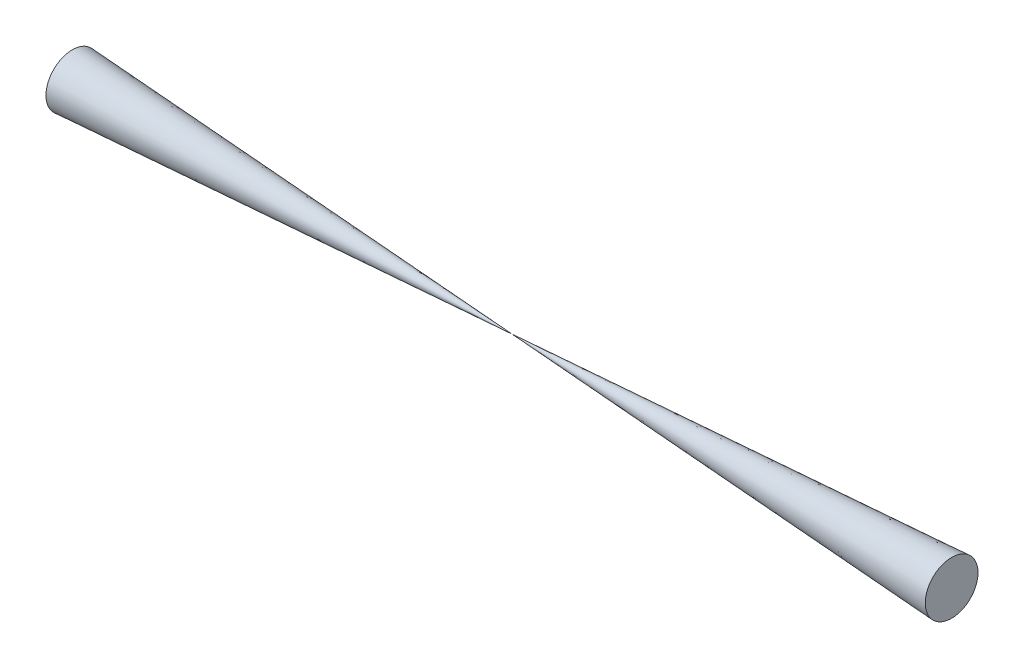
ISO-10303-21;
HEADER;
FILE_DESCRIPTION(('STEP AP214'),'2;1');
FILE_NAME('part.step','',(''),(''),'','','');
FILE_SCHEMA(('AUTOMOTIVE_DESIGN { 1 0 10303 214 1 1 1 1 }'));
ENDSEC;
DATA;
#1=APPLICATION_CONTEXT('core data for automotive mechanical design processes');
#2=APPLICATION_PROTOCOL_DEFINITION('international standard','automotive_design',2000,#1);
#3=PRODUCT_CONTEXT('',#1,'mechanical');
#4=PRODUCT('Part','Part','',(#3));
#5=PRODUCT_RELATED_PRODUCT_CATEGORY('part','',(#4));
#6=PRODUCT_DEFINITION_FORMATION('','',#4);
#7=PRODUCT_DEFINITION_CONTEXT('part definition',#1,'design');
#8=PRODUCT_DEFINITION('design','',#6,#7);
#9=PRODUCT_DEFINITION_SHAPE('','',#8);
#10=(LENGTH_UNIT() NAMED_UNIT(*) SI_UNIT(.MILLI.,.METRE.));
#11=(NAMED_UNIT(*) PLANE_ANGLE_UNIT() SI_UNIT($,.RADIAN.));
#12=(NAMED_UNIT(*) SI_UNIT($,.STERADIAN.) SOLID_ANGLE_UNIT());
#13=UNCERTAINTY_MEASURE_WITH_UNIT(LENGTH_MEASURE(1.E-05),#10,'distance_accuracy_value','');
#14=(GEOMETRIC_REPRESENTATION_CONTEXT(3) GLOBAL_UNCERTAINTY_ASSIGNED_CONTEXT((#13)) GLOBAL_UNIT_ASSIGNED_CONTEXT((#10,
#11,#12)) REPRESENTATION_CONTEXT('',''));
#15=CARTESIAN_POINT('',(0.,0.,0.));
#16=DIRECTION('',(0.,0.,1.));
#17=DIRECTION('',(1.,0.,0.));
#18=AXIS2_PLACEMENT_3D('',#15,#16,#17);
#19=CARTESIAN_POINT('',(200.,0.,0.));
#20=DIRECTION('',(1.,0.,0.));
#21=DIRECTION('',(0.,0.,-1.));
#22=AXIS2_PLACEMENT_3D('',#19,#20,#21);
#23=CONICAL_SURFACE('',#22,12.,0.0598783343266472);
#24=CARTESIAN_POINT('',(0.,0.,0.));
#25=DIRECTION('',(1.,0.,0.));
#26=DIRECTION('',(0.,0.,-1.));
#27=AXIS2_PLACEMENT_3D('',#24,#25,#26);
#28=CIRCLE('',#27,0.01);
#29=CARTESIAN_POINT('',(0.,0.,-0.00999999999999959));
#30=VERTEX_POINT('',#29);
#31=EDGE_CURVE('E42',#30,#30,#28,.T.);
#32=CARTESIAN_POINT('',(200.,0.,0.));
#33=DIRECTION('',(1.,0.,0.));
#34=DIRECTION('',(0.,0.,-1.));
#35=AXIS2_PLACEMENT_3D('',#32,#33,#34);
#36=CIRCLE('',#35,12.);
#37=CARTESIAN_POINT('',(200.,0.,-12.));
#38=VERTEX_POINT('',#37);
#39=EDGE_CURVE('E10',#38,#38,#36,.T.);
#40=CARTESIAN_POINT('',(0.,0.,-0.00999999999999959));
#41=CARTESIAN_POINT('',(2.08333333333334,0.,-0.134895833333333));
#42=CARTESIAN_POINT('',(4.16666666666667,0.,-0.259791666666667));
#43=CARTESIAN_POINT('',(8.33333333333334,0.,-0.509583333333334));
#44=CARTESIAN_POINT('',(10.4166666666667,0.,-0.634479166666668));
#45=CARTESIAN_POINT('',(14.5833333333333,0.,-0.884270833333334));
#46=CARTESIAN_POINT('',(16.6666666666667,0.,-1.00916666666667));
#47=CARTESIAN_POINT('',(20.8333333333333,0.,-1.25895833333333));
#48=CARTESIAN_POINT('',(22.9166666666667,0.,-1.38385416666667));
#49=CARTESIAN_POINT('',(27.0833333333333,0.,-1.63364583333333));
#50=CARTESIAN_POINT('',(29.1666666666667,0.,-1.75854166666667));
#51=CARTESIAN_POINT('',(33.3333333333333,0.,-2.00833333333333));
#52=CARTESIAN_POINT('',(35.4166666666667,0.,-2.13322916666667));
#53=CARTESIAN_POINT('',(39.5833333333333,0.,-2.38302083333333));
#54=CARTESIAN_POINT('',(41.6666666666667,0.,-2.50791666666667));
#55=CARTESIAN_POINT('',(45.8333333333333,0.,-2.75770833333333));
#56=CARTESIAN_POINT('',(47.9166666666667,0.,-2.88260416666667));
#57=CARTESIAN_POINT('',(52.0833333333333,0.,-3.13239583333333));
#58=CARTESIAN_POINT('',(54.1666666666667,0.,-3.25729166666667));
#59=CARTESIAN_POINT('',(58.3333333333333,0.,-3.50708333333333));
#60=CARTESIAN_POINT('',(60.4166666666667,0.,-3.63197916666667));
#61=CARTESIAN_POINT('',(64.5833333333333,0.,-3.88177083333333));
#62=CARTESIAN_POINT('',(66.6666666666667,0.,-4.00666666666667));
#63=CARTESIAN_POINT('',(70.8333333333333,0.,-4.25645833333333));
#64=CARTESIAN_POINT('',(72.9166666666667,0.,-4.38135416666667));
#65=CARTESIAN_POINT('',(77.0833333333333,0.,-4.63114583333333));
#66=CARTESIAN_POINT('',(79.1666666666667,0.,-4.75604166666667));
#67=CARTESIAN_POINT('',(83.3333333333333,0.,-5.00583333333333));
#68=CARTESIAN_POINT('',(85.4166666666667,0.,-5.13072916666667));
#69=CARTESIAN_POINT('',(89.5833333333333,0.,-5.38052083333333));
#70=CARTESIAN_POINT('',(91.6666666666667,0.,-5.50541666666667));
#71=CARTESIAN_POINT('',(95.8333333333333,0.,-5.75520833333333));
#72=CARTESIAN_POINT('',(97.9166666666667,0.,-5.88010416666667));
#73=CARTESIAN_POINT('',(102.083333333333,0.,-6.12989583333333));
#74=CARTESIAN_POINT('',(104.166666666667,0.,-6.25479166666667));
#75=CARTESIAN_POINT('',(108.333333333333,0.,-6.50458333333333));
#76=CARTESIAN_POINT('',(110.416666666667,0.,-6.62947916666667));
#77=CARTESIAN_POINT('',(114.583333333333,0.,-6.87927083333333));
#78=CARTESIAN_POINT('',(116.666666666667,0.,-7.00416666666667));
#79=CARTESIAN_POINT('',(120.833333333333,0.,-7.25395833333333));
#80=CARTESIAN_POINT('',(122.916666666667,0.,-7.37885416666667));
#81=CARTESIAN_POINT('',(127.083333333333,0.,-7.62864583333333));
#82=CARTESIAN_POINT('',(129.166666666667,0.,-7.75354166666667));
#83=CARTESIAN_POINT('',(133.333333333333,0.,-8.00333333333333));
#84=CARTESIAN_POINT('',(135.416666666667,0.,-8.12822916666667));
#85=CARTESIAN_POINT('',(139.583333333333,0.,-8.37802083333333));
#86=CARTESIAN_POINT('',(141.666666666667,0.,-8.50291666666667));
#87=CARTESIAN_POINT('',(145.833333333333,0.,-8.75270833333333));
#88=CARTESIAN_POINT('',(147.916666666667,0.,-8.87760416666667));
#89=CARTESIAN_POINT('',(152.083333333333,0.,-9.12739583333333));
#90=CARTESIAN_POINT('',(154.166666666667,0.,-9.25229166666667));
#91=CARTESIAN_POINT('',(158.333333333333,0.,-9.50208333333333));
#92=CARTESIAN_POINT('',(160.416666666667,0.,-9.62697916666666));
#93=CARTESIAN_POINT('',(164.583333333333,0.,-9.87677083333333));
#94=CARTESIAN_POINT('',(166.666666666667,0.,-10.0016666666667));
#95=CARTESIAN_POINT('',(170.833333333333,0.,-10.2514583333333));
#96=CARTESIAN_POINT('',(172.916666666667,0.,-10.3763541666667));
#97=CARTESIAN_POINT('',(177.083333333333,0.,-10.6261458333333));
#98=CARTESIAN_POINT('',(179.166666666667,0.,-10.7510416666667));
#99=CARTESIAN_POINT('',(183.333333333333,0.,-11.0008333333333));
#100=CARTESIAN_POINT('',(185.416666666667,0.,-11.1257291666667));
#101=CARTESIAN_POINT('',(189.583333333333,0.,-11.3755208333333));
#102=CARTESIAN_POINT('',(191.666666666667,0.,-11.5004166666667));
#103=CARTESIAN_POINT('',(195.833333333333,0.,-11.7502083333333));
#104=CARTESIAN_POINT('',(197.916666666667,0.,-11.8751041666667));
#105=CARTESIAN_POINT('',(200.,0.,-12.));
#106=B_SPLINE_CURVE_WITH_KNOTS('',3,(#40,#41,#42,#43,#44,#45,#46,#47,#48,#49,#50,#51,#52,#53,
#54,#55,#56,#57,#58,#59,#60,#61,#62,#63,#64,#65,#66,#67,#68,#69,#70,#71,#72,#73,#74,#75,#76,#77,
#78,#79,#80,#81,#82,#83,#84,#85,#86,#87,#88,#89,#90,#91,#92,#93,#94,#95,#96,#97,#98,#99,#100,
#101,#102,#103,#104,#105),.UNSPECIFIED.,.F.,.F.,(4,2,2,2,2,2,2,2,2,2,2,2,2,2,2,2,2,2,2,2,2,2,2,
2,2,2,2,2,2,2,2,2,4),(0.,6.26122118461377,12.5224423692275,18.7836635538413,25.0448847384551,
31.3061059230688,37.5673271076826,43.8285482922964,50.0897694769101,56.3509906615239,
62.6122118461377,68.8734330307515,75.1346542153652,81.395875399979,87.6570965845928,
93.9183177692066,100.17953895382,106.440760138434,112.701981323048,118.963202507662,
125.224423692275,131.485644876889,137.746866061503,144.008087246117,150.269308430731,
156.530529615344,162.791750799958,169.052971984572,175.314193169186,181.575414353799,
187.836635538413,194.097856723027,200.359077907641),.UNSPECIFIED.);
#107=EDGE_CURVE('BSEAM36',#30,#38,#106,.T.);
#108=ORIENTED_EDGE('',*,*,#31,.T.);
#109=ORIENTED_EDGE('',*,*,#39,.F.);
#110=ORIENTED_EDGE('',*,*,#107,.T.);
#111=ORIENTED_EDGE('',*,*,#107,.F.);
#112=EDGE_LOOP('',(#108,#110,#109,#111));
#113=FACE_BOUND('',#112,.T.);
#114=ADVANCED_FACE('F36',(#113),#23,.T.);
#115=CARTESIAN_POINT('',(200.,0.,-12.));
#116=DIRECTION('',(1.,0.,0.));
#117=DIRECTION('',(0.,0.,-1.));
#118=AXIS2_PLACEMENT_3D('',#115,#116,#117);
#119=PLANE('',#118);
#120=ORIENTED_EDGE('',*,*,#39,.T.);
#121=EDGE_LOOP('',(#120));
#122=FACE_BOUND('',#121,.T.);
#123=ADVANCED_FACE('F61',(#122),#119,.T.);
#124=CARTESIAN_POINT('',(-200.,0.,0.));
#125=DIRECTION('',(-1.,0.,0.));
#126=DIRECTION('',(0.,0.,-1.));
#127=AXIS2_PLACEMENT_3D('',#124,#125,#126);
#128=CONICAL_SURFACE('',#127,12.,0.0598783343266472);
#129=CARTESIAN_POINT('',(-200.,0.,0.));
#130=DIRECTION('',(1.,0.,0.));
#131=DIRECTION('',(0.,0.,-1.));
#132=AXIS2_PLACEMENT_3D('',#129,#130,#131);
#133=CIRCLE('',#132,12.);
#134=CARTESIAN_POINT('',(-200.,0.,-12.));
#135=VERTEX_POINT('',#134);
#136=EDGE_CURVE('E46',#135,#135,#133,.T.);
#137=CARTESIAN_POINT('',(0.,0.,-0.00999999999999959));
#138=CARTESIAN_POINT('',(-2.08333333333334,0.,-0.134895833333332));
#139=CARTESIAN_POINT('',(-4.16666666666667,0.,-0.259791666666665));
#140=CARTESIAN_POINT('',(-8.33333333333334,0.,-0.509583333333332));
#141=CARTESIAN_POINT('',(-10.4166666666667,0.,-0.634479166666665));
#142=CARTESIAN_POINT('',(-14.5833333333333,0.,-0.88427083333333));
#143=CARTESIAN_POINT('',(-16.6666666666667,0.,-1.00916666666666));
#144=CARTESIAN_POINT('',(-20.8333333333333,0.,-1.25895833333333));
#145=CARTESIAN_POINT('',(-22.9166666666667,0.,-1.38385416666666));
#146=CARTESIAN_POINT('',(-27.0833333333333,0.,-1.63364583333333));
#147=CARTESIAN_POINT('',(-29.1666666666667,0.,-1.75854166666666));
#148=CARTESIAN_POINT('',(-33.3333333333333,0.,-2.00833333333333));
#149=CARTESIAN_POINT('',(-35.4166666666667,0.,-2.13322916666666));
#150=CARTESIAN_POINT('',(-39.5833333333333,0.,-2.38302083333332));
#151=CARTESIAN_POINT('',(-41.6666666666667,0.,-2.50791666666666));
#152=CARTESIAN_POINT('',(-45.8333333333333,0.,-2.75770833333332));
#153=CARTESIAN_POINT('',(-47.9166666666667,0.,-2.88260416666666));
#154=CARTESIAN_POINT('',(-52.0833333333333,0.,-3.13239583333332));
#155=CARTESIAN_POINT('',(-54.1666666666667,0.,-3.25729166666665));
#156=CARTESIAN_POINT('',(-58.3333333333333,0.,-3.50708333333332));
#157=CARTESIAN_POINT('',(-60.4166666666667,0.,-3.63197916666665));
#158=CARTESIAN_POINT('',(-64.5833333333333,0.,-3.88177083333332));
#159=CARTESIAN_POINT('',(-66.6666666666667,0.,-4.00666666666665));
#160=CARTESIAN_POINT('',(-70.8333333333334,0.,-4.25645833333332));
#161=CARTESIAN_POINT('',(-72.9166666666667,0.,-4.38135416666665));
#162=CARTESIAN_POINT('',(-77.0833333333334,0.,-4.63114583333332));
#163=CARTESIAN_POINT('',(-79.1666666666667,0.,-4.75604166666665));
#164=CARTESIAN_POINT('',(-83.3333333333334,0.,-5.00583333333331));
#165=CARTESIAN_POINT('',(-85.4166666666667,0.,-5.13072916666665));
#166=CARTESIAN_POINT('',(-89.5833333333333,0.,-5.38052083333331));
#167=CARTESIAN_POINT('',(-91.6666666666667,0.,-5.50541666666664));
#168=CARTESIAN_POINT('',(-95.8333333333334,0.,-5.75520833333331));
#169=CARTESIAN_POINT('',(-97.9166666666667,0.,-5.88010416666664));
#170=CARTESIAN_POINT('',(-102.083333333333,0.,-6.12989583333331));
#171=CARTESIAN_POINT('',(-104.166666666667,0.,-6.25479166666664));
#172=CARTESIAN_POINT('',(-108.333333333333,0.,-6.50458333333331));
#173=CARTESIAN_POINT('',(-110.416666666667,0.,-6.62947916666664));
#174=CARTESIAN_POINT('',(-114.583333333333,0.,-6.87927083333331));
#175=CARTESIAN_POINT('',(-116.666666666667,0.,-7.00416666666664));
#176=CARTESIAN_POINT('',(-120.833333333333,0.,-7.2539583333333));
#177=CARTESIAN_POINT('',(-122.916666666667,0.,-7.37885416666664));
#178=CARTESIAN_POINT('',(-127.083333333333,0.,-7.6286458333333));
#179=CARTESIAN_POINT('',(-129.166666666667,0.,-7.75354166666664));
#180=CARTESIAN_POINT('',(-133.333333333333,0.,-8.0033333333333));
#181=CARTESIAN_POINT('',(-135.416666666667,0.,-8.12822916666664));
#182=CARTESIAN_POINT('',(-139.583333333333,0.,-8.3780208333333));
#183=CARTESIAN_POINT('',(-141.666666666667,0.,-8.50291666666663));
#184=CARTESIAN_POINT('',(-145.833333333333,0.,-8.7527083333333));
#185=CARTESIAN_POINT('',(-147.916666666667,0.,-8.87760416666663));
#186=CARTESIAN_POINT('',(-152.083333333333,0.,-9.1273958333333));
#187=CARTESIAN_POINT('',(-154.166666666667,0.,-9.25229166666663));
#188=CARTESIAN_POINT('',(-158.333333333333,0.,-9.5020833333333));
#189=CARTESIAN_POINT('',(-160.416666666667,0.,-9.62697916666663));
#190=CARTESIAN_POINT('',(-164.583333333333,0.,-9.8767708333333));
#191=CARTESIAN_POINT('',(-166.666666666667,0.,-10.0016666666666));
#192=CARTESIAN_POINT('',(-170.833333333333,0.,-10.2514583333333));
#193=CARTESIAN_POINT('',(-172.916666666667,0.,-10.3763541666666));
#194=CARTESIAN_POINT('',(-177.083333333333,0.,-10.6261458333333));
#195=CARTESIAN_POINT('',(-179.166666666667,0.,-10.7510416666666));
#196=CARTESIAN_POINT('',(-183.333333333333,0.,-11.0008333333333));
#197=CARTESIAN_POINT('',(-185.416666666667,0.,-11.1257291666666));
#198=CARTESIAN_POINT('',(-189.583333333333,0.,-11.3755208333333));
#199=CARTESIAN_POINT('',(-191.666666666667,0.,-11.5004166666666));
#200=CARTESIAN_POINT('',(-195.833333333333,0.,-11.7502083333333));
#201=CARTESIAN_POINT('',(-197.916666666667,0.,-11.8751041666666));
#202=CARTESIAN_POINT('',(-200.,0.,-12.));
#203=B_SPLINE_CURVE_WITH_KNOTS('',3,(#137,#138,#139,#140,#141,#142,#143,#144,#145,#146,#147,
#148,#149,#150,#151,#152,#153,#154,#155,#156,#157,#158,#159,#160,#161,#162,#163,#164,#165,#166,
#167,#168,#169,#170,#171,#172,#173,#174,#175,#176,#177,#178,#179,#180,#181,#182,#183,#184,#185,
#186,#187,#188,#189,#190,#191,#192,#193,#194,#195,#196,#197,#198,#199,#200,#201,#202),
.UNSPECIFIED.,.F.,.F.,(4,2,2,2,2,2,2,2,2,2,2,2,2,2,2,2,2,2,2,2,2,2,2,2,2,2,2,2,2,2,2,2,4),(0.,
6.26122118461377,12.5224423692275,18.7836635538413,25.0448847384551,31.3061059230688,
37.5673271076826,43.8285482922964,50.0897694769102,56.3509906615239,62.6122118461377,
68.8734330307515,75.1346542153652,81.395875399979,87.6570965845928,93.9183177692066,
100.17953895382,106.440760138434,112.701981323048,118.963202507662,125.224423692275,
131.485644876889,137.746866061503,144.008087246117,150.269308430731,156.530529615344,
162.791750799958,169.052971984572,175.314193169186,181.575414353799,187.836635538413,
194.097856723027,200.359077907641),.UNSPECIFIED.);
#204=EDGE_CURVE('BSEAM53',#30,#135,#203,.T.);
#205=ORIENTED_EDGE('',*,*,#31,.F.);
#206=ORIENTED_EDGE('',*,*,#136,.T.);
#207=ORIENTED_EDGE('',*,*,#204,.T.);
#208=ORIENTED_EDGE('',*,*,#204,.F.);
#209=EDGE_LOOP('',(#205,#207,#206,#208));
#210=FACE_BOUND('',#209,.T.);
#211=ADVANCED_FACE('F53',(#210),#128,.T.);
#212=CARTESIAN_POINT('',(-200.,0.,-12.));
#213=DIRECTION('',(-1.,0.,0.));
#214=DIRECTION('',(0.,0.,-1.));
#215=AXIS2_PLACEMENT_3D('',#212,#213,#214);
#216=PLANE('',#215);
#217=ORIENTED_EDGE('',*,*,#136,.F.);
#218=EDGE_LOOP('',(#217));
#219=FACE_BOUND('',#218,.T.);
#220=ADVANCED_FACE('F55',(#219),#216,.T.);
#221=CLOSED_SHELL('',(#114,#123,#211,#220));
#222=MANIFOLD_SOLID_BREP('B2',#221);
#223=ADVANCED_BREP_SHAPE_REPRESENTATION('',(#18,#222),#14);
#224=SHAPE_DEFINITION_REPRESENTATION(#9,#223);
ENDSEC;
END-ISO-10303-21;
